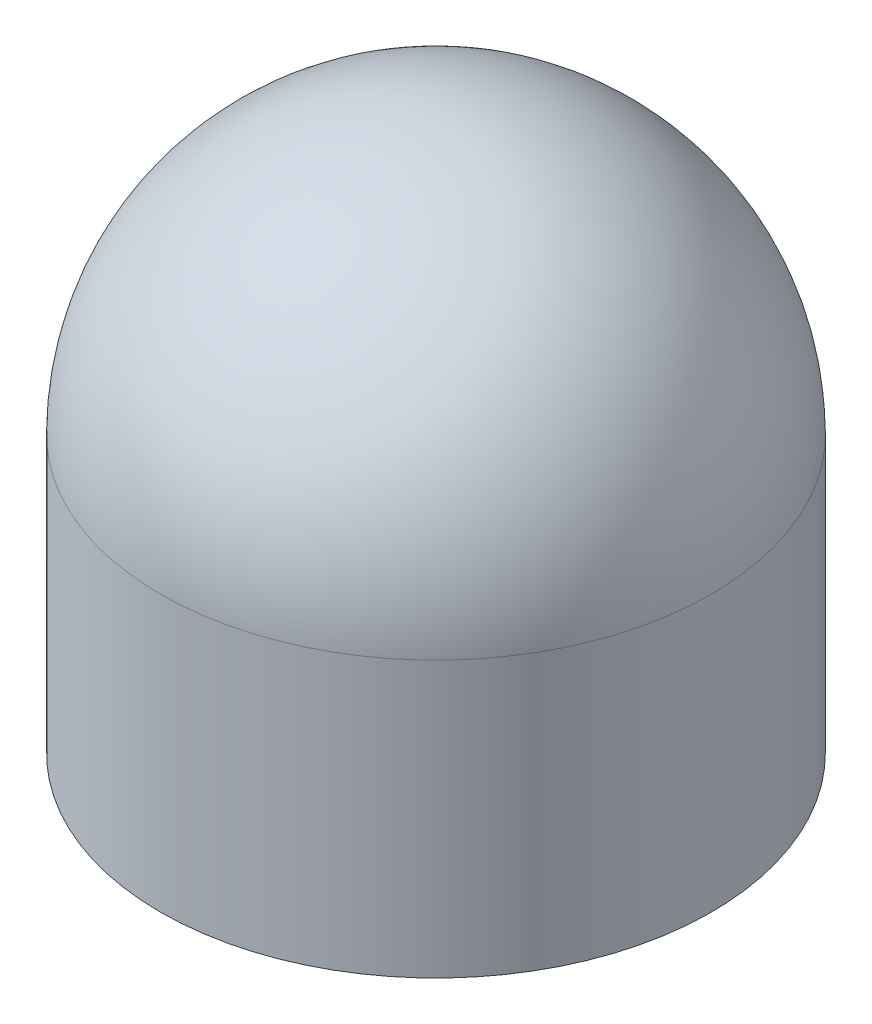
ISO-10303-21;
HEADER;
FILE_DESCRIPTION(('STEP AP214'),'2;1');
FILE_NAME('part.step','',(''),(''),'','','');
FILE_SCHEMA(('AUTOMOTIVE_DESIGN { 1 0 10303 214 1 1 1 1 }'));
ENDSEC;
DATA;
#1=APPLICATION_CONTEXT('core data for automotive mechanical design processes');
#2=APPLICATION_PROTOCOL_DEFINITION('international standard','automotive_design',2000,#1);
#3=PRODUCT_CONTEXT('',#1,'mechanical');
#4=PRODUCT('Part','Part','',(#3));
#5=PRODUCT_RELATED_PRODUCT_CATEGORY('part','',(#4));
#6=PRODUCT_DEFINITION_FORMATION('','',#4);
#7=PRODUCT_DEFINITION_CONTEXT('part definition',#1,'design');
#8=PRODUCT_DEFINITION('design','',#6,#7);
#9=PRODUCT_DEFINITION_SHAPE('','',#8);
#10=(LENGTH_UNIT() NAMED_UNIT(*) SI_UNIT(.MILLI.,.METRE.));
#11=(NAMED_UNIT(*) PLANE_ANGLE_UNIT() SI_UNIT($,.RADIAN.));
#12=(NAMED_UNIT(*) SI_UNIT($,.STERADIAN.) SOLID_ANGLE_UNIT());
#13=UNCERTAINTY_MEASURE_WITH_UNIT(LENGTH_MEASURE(1.E-05),#10,'distance_accuracy_value','');
#14=(GEOMETRIC_REPRESENTATION_CONTEXT(3) GLOBAL_UNCERTAINTY_ASSIGNED_CONTEXT((#13)) GLOBAL_UNIT_ASSIGNED_CONTEXT((#10,
#11,#12)) REPRESENTATION_CONTEXT('',''));
#15=CARTESIAN_POINT('',(0.,0.,0.));
#16=DIRECTION('',(0.,0.,1.));
#17=DIRECTION('',(1.,0.,0.));
#18=AXIS2_PLACEMENT_3D('',#15,#16,#17);
#19=CARTESIAN_POINT('',(0.,0.,0.));
#20=DIRECTION('',(0.,-1.,0.));
#21=DIRECTION('',(0.,0.,-1.));
#22=AXIS2_PLACEMENT_3D('',#19,#20,#21);
#23=PLANE('',#22);
#24=CARTESIAN_POINT('',(0.,0.,0.));
#25=DIRECTION('',(0.,-1.,0.));
#26=DIRECTION('',(0.,0.,-1.));
#27=AXIS2_PLACEMENT_3D('',#24,#25,#26);
#28=CIRCLE('',#27,1.5);
#29=CARTESIAN_POINT('',(0.,0.,-1.5));
#30=VERTEX_POINT('',#29);
#31=EDGE_CURVE('E43',#30,#30,#28,.T.);
#32=ORIENTED_EDGE('',*,*,#31,.F.);
#33=EDGE_LOOP('',(#32));
#34=FACE_BOUND('',#33,.T.);
#35=CARTESIAN_POINT('',(0.,0.,0.));
#36=DIRECTION('',(0.,1.,0.));
#37=DIRECTION('',(0.,0.,1.));
#38=AXIS2_PLACEMENT_3D('',#35,#36,#37);
#39=CIRCLE('',#38,3.175);
#40=CARTESIAN_POINT('',(0.,0.,3.175));
#41=VERTEX_POINT('',#40);
#42=EDGE_CURVE('E10',#41,#41,#39,.T.);
#43=ORIENTED_EDGE('',*,*,#42,.F.);
#44=EDGE_LOOP('',(#43));
#45=FACE_BOUND('',#44,.T.);
#46=ADVANCED_FACE('F29',(#34,#45),#23,.T.);
#47=CARTESIAN_POINT('',(0.,0.,0.));
#48=DIRECTION('',(0.,1.,0.));
#49=DIRECTION('',(0.,0.,1.));
#50=AXIS2_PLACEMENT_3D('',#47,#48,#49);
#51=CYLINDRICAL_SURFACE('',#50,3.175);
#52=ORIENTED_EDGE('',*,*,#42,.T.);
#53=EDGE_LOOP('',(#52));
#54=FACE_BOUND('',#53,.T.);
#55=CARTESIAN_POINT('',(0.,3.175,0.));
#56=DIRECTION('',(0.,1.,0.));
#57=DIRECTION('',(0.,0.,1.));
#58=AXIS2_PLACEMENT_3D('',#55,#56,#57);
#59=CIRCLE('',#58,3.175);
#60=CARTESIAN_POINT('',(0.,3.175,3.175));
#61=VERTEX_POINT('',#60);
#62=EDGE_CURVE('E35',#61,#61,#59,.T.);
#63=ORIENTED_EDGE('',*,*,#62,.F.);
#64=EDGE_LOOP('',(#63));
#65=FACE_BOUND('',#64,.T.);
#66=ADVANCED_FACE('F53',(#54,#65),#51,.T.);
#67=CARTESIAN_POINT('',(0.,3.175,0.));
#68=DIRECTION('',(0.,1.,0.));
#69=DIRECTION('',(0.,0.,1.));
#70=AXIS2_PLACEMENT_3D('',#67,#68,#69);
#71=SPHERICAL_SURFACE('',#70,3.175);
#72=ORIENTED_EDGE('',*,*,#62,.T.);
#73=EDGE_LOOP('',(#72));
#74=FACE_BOUND('',#73,.T.);
#75=ADVANCED_FACE('F57',(#74),#71,.T.);
#76=CARTESIAN_POINT('',(0.,3.175,0.));
#77=DIRECTION('',(0.,-1.,0.));
#78=DIRECTION('',(0.,0.,-1.));
#79=AXIS2_PLACEMENT_3D('',#76,#77,#78);
#80=CYLINDRICAL_SURFACE('',#79,1.5);
#81=CARTESIAN_POINT('',(0.,3.175,0.));
#82=DIRECTION('',(0.,-1.,0.));
#83=DIRECTION('',(0.,0.,-1.));
#84=AXIS2_PLACEMENT_3D('',#81,#82,#83);
#85=CIRCLE('',#84,1.5);
#86=CARTESIAN_POINT('',(0.,3.175,-1.5));
#87=VERTEX_POINT('',#86);
#88=EDGE_CURVE('E39',#87,#87,#85,.T.);
#89=ORIENTED_EDGE('',*,*,#88,.F.);
#90=EDGE_LOOP('',(#89));
#91=FACE_BOUND('',#90,.T.);
#92=ORIENTED_EDGE('',*,*,#31,.T.);
#93=EDGE_LOOP('',(#92));
#94=FACE_BOUND('',#93,.T.);
#95=ADVANCED_FACE('F49',(#91,#94),#80,.F.);
#96=CARTESIAN_POINT('',(0.,3.175,0.));
#97=DIRECTION('',(0.,-1.,0.));
#98=DIRECTION('',(0.,0.,-1.));
#99=AXIS2_PLACEMENT_3D('',#96,#97,#98);
#100=PLANE('',#99);
#101=ORIENTED_EDGE('',*,*,#88,.T.);
#102=EDGE_LOOP('',(#101));
#103=FACE_BOUND('',#102,.T.);
#104=ADVANCED_FACE('F66',(#103),#100,.T.);
#105=CLOSED_SHELL('',(#46,#66,#75,#95,#104));
#106=MANIFOLD_SOLID_BREP('B2',#105);
#107=ADVANCED_BREP_SHAPE_REPRESENTATION('',(#18,#106),#14);
#108=SHAPE_DEFINITION_REPRESENTATION(#9,#107);
ENDSEC;
END-ISO-10303-21;
